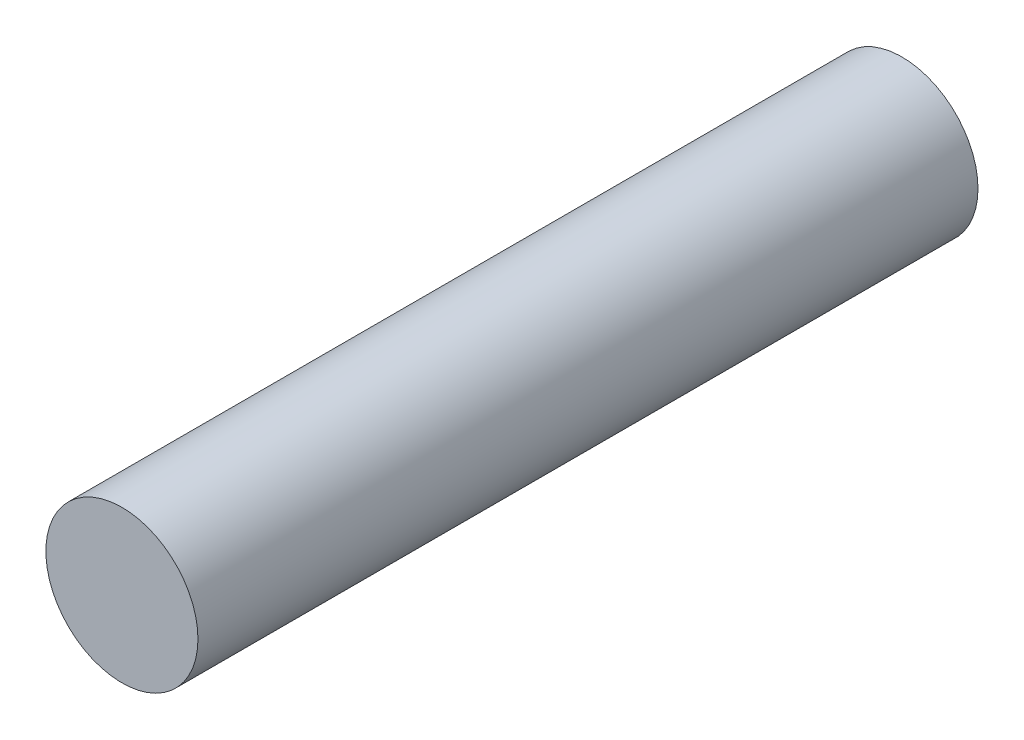
ISO-10303-21;
HEADER;
FILE_DESCRIPTION(('STEP AP214'),'2;1');
FILE_NAME('part.step','',(''),(''),'','','');
FILE_SCHEMA(('AUTOMOTIVE_DESIGN { 1 0 10303 214 1 1 1 1 }'));
ENDSEC;
DATA;
#1=APPLICATION_CONTEXT('core data for automotive mechanical design processes');
#2=APPLICATION_PROTOCOL_DEFINITION('international standard','automotive_design',2000,#1);
#3=PRODUCT_CONTEXT('',#1,'mechanical');
#4=PRODUCT('Part','Part','',(#3));
#5=PRODUCT_RELATED_PRODUCT_CATEGORY('part','',(#4));
#6=PRODUCT_DEFINITION_FORMATION('','',#4);
#7=PRODUCT_DEFINITION_CONTEXT('part definition',#1,'design');
#8=PRODUCT_DEFINITION('design','',#6,#7);
#9=PRODUCT_DEFINITION_SHAPE('','',#8);
#10=(LENGTH_UNIT() NAMED_UNIT(*) SI_UNIT(.MILLI.,.METRE.));
#11=(NAMED_UNIT(*) PLANE_ANGLE_UNIT() SI_UNIT($,.RADIAN.));
#12=(NAMED_UNIT(*) SI_UNIT($,.STERADIAN.) SOLID_ANGLE_UNIT());
#13=UNCERTAINTY_MEASURE_WITH_UNIT(LENGTH_MEASURE(1.E-05),#10,'distance_accuracy_value','');
#14=(GEOMETRIC_REPRESENTATION_CONTEXT(3) GLOBAL_UNCERTAINTY_ASSIGNED_CONTEXT((#13)) GLOBAL_UNIT_ASSIGNED_CONTEXT((#10,
#11,#12)) REPRESENTATION_CONTEXT('',''));
#15=CARTESIAN_POINT('',(0.,0.,0.));
#16=DIRECTION('',(0.,0.,1.));
#17=DIRECTION('',(1.,0.,0.));
#18=AXIS2_PLACEMENT_3D('',#15,#16,#17);
#19=CARTESIAN_POINT('',(0.,0.,12.7));
#20=DIRECTION('',(0.,0.,-1.));
#21=DIRECTION('',(-1.,0.,0.));
#22=AXIS2_PLACEMENT_3D('',#19,#20,#21);
#23=CYLINDRICAL_SURFACE('',#22,2.4765);
#24=CARTESIAN_POINT('',(0.,0.,12.7));
#25=DIRECTION('',(0.,0.,1.));
#26=DIRECTION('',(1.,0.,0.));
#27=AXIS2_PLACEMENT_3D('',#24,#25,#26);
#28=CIRCLE('',#27,2.4765);
#29=CARTESIAN_POINT('',(2.4765,0.,12.7));
#30=VERTEX_POINT('',#29);
#31=EDGE_CURVE('E10',#30,#30,#28,.T.);
#32=ORIENTED_EDGE('',*,*,#31,.F.);
#33=EDGE_LOOP('',(#32));
#34=FACE_BOUND('',#33,.T.);
#35=CARTESIAN_POINT('',(0.,0.,-12.7));
#36=DIRECTION('',(0.,0.,1.));
#37=DIRECTION('',(1.,0.,0.));
#38=AXIS2_PLACEMENT_3D('',#35,#36,#37);
#39=CIRCLE('',#38,2.4765);
#40=CARTESIAN_POINT('',(2.4765,0.,-12.7));
#41=VERTEX_POINT('',#40);
#42=EDGE_CURVE('E42',#41,#41,#39,.T.);
#43=ORIENTED_EDGE('',*,*,#42,.T.);
#44=EDGE_LOOP('',(#43));
#45=FACE_BOUND('',#44,.T.);
#46=ADVANCED_FACE('F39',(#34,#45),#23,.T.);
#47=CARTESIAN_POINT('',(0.,0.,12.7));
#48=DIRECTION('',(0.,0.,1.));
#49=DIRECTION('',(1.,0.,0.));
#50=AXIS2_PLACEMENT_3D('',#47,#48,#49);
#51=PLANE('',#50);
#52=ORIENTED_EDGE('',*,*,#31,.T.);
#53=EDGE_LOOP('',(#52));
#54=FACE_BOUND('',#53,.T.);
#55=ADVANCED_FACE('F54',(#54),#51,.T.);
#56=CARTESIAN_POINT('',(0.,0.,-12.7));
#57=DIRECTION('',(0.,0.,1.));
#58=DIRECTION('',(1.,0.,0.));
#59=AXIS2_PLACEMENT_3D('',#56,#57,#58);
#60=PLANE('',#59);
#61=ORIENTED_EDGE('',*,*,#42,.F.);
#62=EDGE_LOOP('',(#61));
#63=FACE_BOUND('',#62,.T.);
#64=ADVANCED_FACE('F52',(#63),#60,.F.);
#65=CLOSED_SHELL('',(#46,#55,#64));
#66=MANIFOLD_SOLID_BREP('B2',#65);
#67=ADVANCED_BREP_SHAPE_REPRESENTATION('',(#18,#66),#14);
#68=SHAPE_DEFINITION_REPRESENTATION(#9,#67);
ENDSEC;
END-ISO-10303-21;
